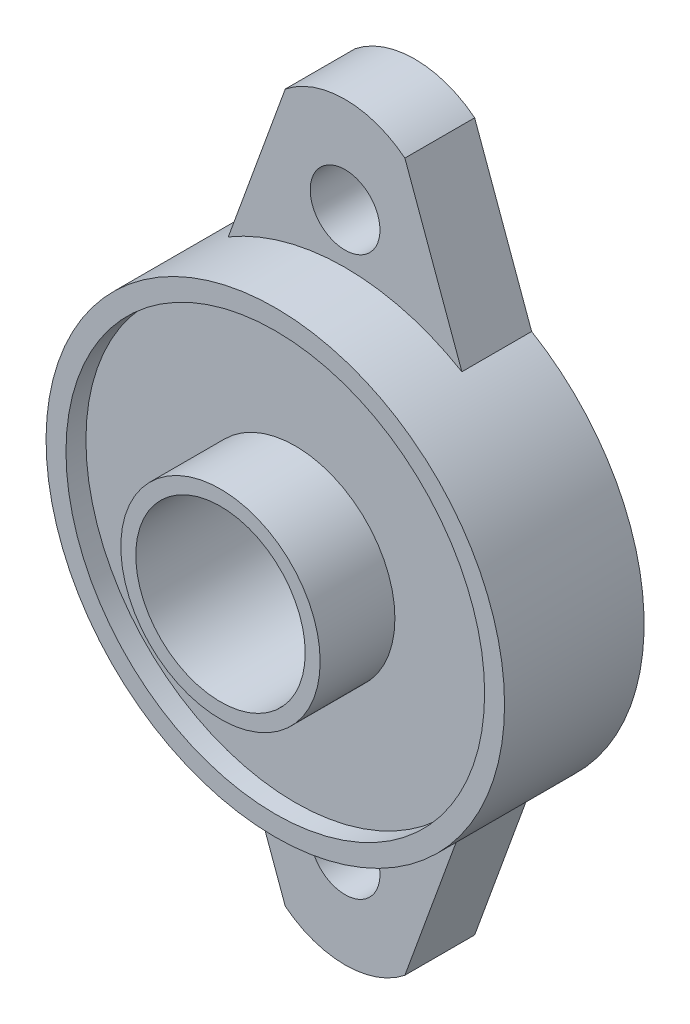
ISO-10303-21;
HEADER;
FILE_DESCRIPTION(('STEP AP214'),'2;1');
FILE_NAME('part.step','',(''),(''),'','','');
FILE_SCHEMA(('AUTOMOTIVE_DESIGN { 1 0 10303 214 1 1 1 1 }'));
ENDSEC;
DATA;
#1=APPLICATION_CONTEXT('core data for automotive mechanical design processes');
#2=APPLICATION_PROTOCOL_DEFINITION('international standard','automotive_design',2000,#1);
#3=PRODUCT_CONTEXT('',#1,'mechanical');
#4=PRODUCT('Part','Part','',(#3));
#5=PRODUCT_RELATED_PRODUCT_CATEGORY('part','',(#4));
#6=PRODUCT_DEFINITION_FORMATION('','',#4);
#7=PRODUCT_DEFINITION_CONTEXT('part definition',#1,'design');
#8=PRODUCT_DEFINITION('design','',#6,#7);
#9=PRODUCT_DEFINITION_SHAPE('','',#8);
#10=(LENGTH_UNIT() NAMED_UNIT(*) SI_UNIT(.MILLI.,.METRE.));
#11=(NAMED_UNIT(*) PLANE_ANGLE_UNIT() SI_UNIT($,.RADIAN.));
#12=(NAMED_UNIT(*) SI_UNIT($,.STERADIAN.) SOLID_ANGLE_UNIT());
#13=UNCERTAINTY_MEASURE_WITH_UNIT(LENGTH_MEASURE(1.E-05),#10,'distance_accuracy_value','');
#14=(GEOMETRIC_REPRESENTATION_CONTEXT(3) GLOBAL_UNCERTAINTY_ASSIGNED_CONTEXT((#13)) GLOBAL_UNIT_ASSIGNED_CONTEXT((#10,
#11,#12)) REPRESENTATION_CONTEXT('',''));
#15=CARTESIAN_POINT('',(0.,0.,0.));
#16=DIRECTION('',(0.,0.,1.));
#17=DIRECTION('',(1.,0.,0.));
#18=AXIS2_PLACEMENT_3D('',#15,#16,#17);
#19=CARTESIAN_POINT('',(0.,0.,14.));
#20=DIRECTION('',(0.,0.,1.));
#21=DIRECTION('',(1.,0.,0.));
#22=AXIS2_PLACEMENT_3D('',#19,#20,#21);
#23=PLANE('',#22);
#24=CARTESIAN_POINT('',(0.,0.,14.));
#25=DIRECTION('',(0.,0.,1.));
#26=DIRECTION('',(1.,0.,0.));
#27=AXIS2_PLACEMENT_3D('',#24,#25,#26);
#28=CIRCLE('',#27,21.);
#29=CARTESIAN_POINT('',(21.,0.,14.));
#30=VERTEX_POINT('',#29);
#31=EDGE_CURVE('E208',#30,#30,#28,.T.);
#32=ORIENTED_EDGE('',*,*,#31,.F.);
#33=EDGE_LOOP('',(#32));
#34=FACE_BOUND('',#33,.T.);
#35=CARTESIAN_POINT('',(0.,0.,14.));
#36=DIRECTION('',(0.,0.,1.));
#37=DIRECTION('',(1.,0.,0.));
#38=AXIS2_PLACEMENT_3D('',#35,#36,#37);
#39=CIRCLE('',#38,23.);
#40=CARTESIAN_POINT('',(23.,0.,14.));
#41=VERTEX_POINT('',#40);
#42=EDGE_CURVE('E196',#41,#41,#39,.T.);
#43=ORIENTED_EDGE('',*,*,#42,.T.);
#44=EDGE_LOOP('',(#43));
#45=FACE_BOUND('',#44,.T.);
#46=ADVANCED_FACE('F35',(#34,#45),#23,.T.);
#47=CARTESIAN_POINT('',(0.,0.,7.));
#48=DIRECTION('',(0.,0.,-1.));
#49=DIRECTION('',(-1.,0.,0.));
#50=AXIS2_PLACEMENT_3D('',#47,#48,#49);
#51=PLANE('',#50);
#52=CARTESIAN_POINT('',(0.,28.,7.));
#53=DIRECTION('',(0.,0.,1.));
#54=DIRECTION('',(1.,0.,0.));
#55=AXIS2_PLACEMENT_3D('',#52,#53,#54);
#56=CIRCLE('',#55,3.5);
#57=CARTESIAN_POINT('',(3.5,28.,7.));
#58=VERTEX_POINT('',#57);
#59=EDGE_CURVE('E137',#58,#58,#56,.T.);
#60=ORIENTED_EDGE('',*,*,#59,.F.);
#61=EDGE_LOOP('',(#60));
#62=FACE_BOUND('',#61,.T.);
#63=CARTESIAN_POINT('',(0.,0.,7.));
#64=DIRECTION('',(0.,0.,1.));
#65=DIRECTION('',(1.,0.,0.));
#66=AXIS2_PLACEMENT_3D('',#63,#64,#65);
#67=CIRCLE('',#66,23.);
#68=CARTESIAN_POINT('',(11.7174446423163,19.7914499482543,7.));
#69=VERTEX_POINT('',#68);
#70=CARTESIAN_POINT('',(-11.7174446423163,19.7914499482543,7.));
#71=VERTEX_POINT('',#70);
#72=EDGE_CURVE('E46',#69,#71,#67,.T.);
#73=ORIENTED_EDGE('',*,*,#72,.F.);
#74=DIRECTION('',(-0.342020143325669,0.939692620785908,0.));
#75=VECTOR('',#74,1.);
#76=CARTESIAN_POINT('',(11.7174446423163,19.7914499482543,7.));
#77=LINE('',#76,#75);
#78=CARTESIAN_POINT('',(6.,35.5,7.));
#79=VERTEX_POINT('',#78);
#80=EDGE_CURVE('E99',#69,#79,#77,.T.);
#81=ORIENTED_EDGE('',*,*,#80,.T.);
#82=CARTESIAN_POINT('',(0.,28.,7.));
#83=DIRECTION('',(0.,0.,1.));
#84=DIRECTION('',(1.,0.,0.));
#85=AXIS2_PLACEMENT_3D('',#82,#83,#84);
#86=CIRCLE('',#85,9.60468635614927);
#87=CARTESIAN_POINT('',(-6.,35.5,7.));
#88=VERTEX_POINT('',#87);
#89=EDGE_CURVE('E180',#79,#88,#86,.T.);
#90=ORIENTED_EDGE('',*,*,#89,.T.);
#91=DIRECTION('',(-0.342020143325669,-0.939692620785908,0.));
#92=VECTOR('',#91,1.);
#93=CARTESIAN_POINT('',(-11.7174446423163,19.7914499482543,7.));
#94=LINE('',#93,#92);
#95=EDGE_CURVE('E118',#88,#71,#94,.T.);
#96=ORIENTED_EDGE('',*,*,#95,.T.);
#97=EDGE_LOOP('',(#73,#81,#90,#96));
#98=FACE_BOUND('',#97,.T.);
#99=ADVANCED_FACE('F233',(#62,#98),#51,.F.);
#100=CARTESIAN_POINT('',(0.,-28.,7.));
#101=DIRECTION('',(0.,0.,1.));
#102=DIRECTION('',(-1.,0.,0.));
#103=AXIS2_PLACEMENT_3D('',#100,#101,#102);
#104=CIRCLE('',#103,3.5);
#105=CARTESIAN_POINT('',(-3.5,-28.,7.));
#106=VERTEX_POINT('',#105);
#107=EDGE_CURVE('E192',#106,#106,#104,.T.);
#108=ORIENTED_EDGE('',*,*,#107,.F.);
#109=EDGE_LOOP('',(#108));
#110=FACE_BOUND('',#109,.T.);
#111=CARTESIAN_POINT('',(-11.7174446423163,-19.7914499482543,7.));
#112=VERTEX_POINT('',#111);
#113=CARTESIAN_POINT('',(11.7174446423163,-19.7914499482543,7.));
#114=VERTEX_POINT('',#113);
#115=EDGE_CURVE('E11',#112,#114,#67,.T.);
#116=ORIENTED_EDGE('',*,*,#115,.F.);
#117=DIRECTION('',(0.342020143325669,-0.939692620785908,0.));
#118=VECTOR('',#117,1.);
#119=CARTESIAN_POINT('',(-11.7174446423163,-19.7914499482543,7.));
#120=LINE('',#119,#118);
#121=CARTESIAN_POINT('',(-6.,-35.5,7.));
#122=VERTEX_POINT('',#121);
#123=EDGE_CURVE('E110',#112,#122,#120,.T.);
#124=ORIENTED_EDGE('',*,*,#123,.T.);
#125=CARTESIAN_POINT('',(0.,-28.,7.));
#126=DIRECTION('',(0.,0.,1.));
#127=DIRECTION('',(-1.,0.,0.));
#128=AXIS2_PLACEMENT_3D('',#125,#126,#127);
#129=CIRCLE('',#128,9.60468635614927);
#130=CARTESIAN_POINT('',(6.,-35.5,7.));
#131=VERTEX_POINT('',#130);
#132=EDGE_CURVE('E114',#122,#131,#129,.T.);
#133=ORIENTED_EDGE('',*,*,#132,.T.);
#134=DIRECTION('',(0.342020143325669,0.939692620785908,0.));
#135=VECTOR('',#134,1.);
#136=CARTESIAN_POINT('',(11.7174446423163,-19.7914499482543,7.));
#137=LINE('',#136,#135);
#138=EDGE_CURVE('E54',#131,#114,#137,.T.);
#139=ORIENTED_EDGE('',*,*,#138,.T.);
#140=EDGE_LOOP('',(#116,#124,#133,#139));
#141=FACE_BOUND('',#140,.T.);
#142=ADVANCED_FACE('F112',(#110,#141),#51,.F.);
#143=CARTESIAN_POINT('',(0.,0.,0.));
#144=DIRECTION('',(0.,0.,-1.));
#145=DIRECTION('',(-1.,0.,0.));
#146=AXIS2_PLACEMENT_3D('',#143,#144,#145);
#147=PLANE('',#146);
#148=CARTESIAN_POINT('',(0.,0.,0.));
#149=DIRECTION('',(0.,0.,1.));
#150=DIRECTION('',(1.,0.,0.));
#151=AXIS2_PLACEMENT_3D('',#148,#149,#150);
#152=CIRCLE('',#151,8.5);
#153=CARTESIAN_POINT('',(8.5,0.,0.));
#154=VERTEX_POINT('',#153);
#155=EDGE_CURVE('E187',#154,#154,#152,.T.);
#156=ORIENTED_EDGE('',*,*,#155,.T.);
#157=EDGE_LOOP('',(#156));
#158=FACE_BOUND('',#157,.T.);
#159=CARTESIAN_POINT('',(0.,0.,0.));
#160=DIRECTION('',(0.,0.,1.));
#161=DIRECTION('',(-1.,0.,0.));
#162=AXIS2_PLACEMENT_3D('',#159,#160,#161);
#163=CIRCLE('',#162,23.);
#164=CARTESIAN_POINT('',(11.7174446423163,-19.7914499482543,0.));
#165=VERTEX_POINT('',#164);
#166=CARTESIAN_POINT('',(11.7174446423163,19.7914499482543,0.));
#167=VERTEX_POINT('',#166);
#168=EDGE_CURVE('E133',#165,#167,#163,.T.);
#169=ORIENTED_EDGE('',*,*,#168,.F.);
#170=DIRECTION('',(0.342020143325669,0.939692620785908,0.));
#171=VECTOR('',#170,1.);
#172=CARTESIAN_POINT('',(11.7174446423163,-19.7914499482543,0.));
#173=LINE('',#172,#171);
#174=CARTESIAN_POINT('',(6.,-35.5,0.));
#175=VERTEX_POINT('',#174);
#176=EDGE_CURVE('E90',#175,#165,#173,.T.);
#177=ORIENTED_EDGE('',*,*,#176,.F.);
#178=CARTESIAN_POINT('',(0.,-28.,0.));
#179=DIRECTION('',(0.,0.,1.));
#180=DIRECTION('',(-1.,0.,0.));
#181=AXIS2_PLACEMENT_3D('',#178,#179,#180);
#182=CIRCLE('',#181,9.60468635614927);
#183=CARTESIAN_POINT('',(-6.,-35.5,0.));
#184=VERTEX_POINT('',#183);
#185=EDGE_CURVE('E84',#184,#175,#182,.T.);
#186=ORIENTED_EDGE('',*,*,#185,.F.);
#187=DIRECTION('',(0.342020143325669,-0.939692620785908,0.));
#188=VECTOR('',#187,1.);
#189=CARTESIAN_POINT('',(-11.7174446423163,-19.7914499482543,0.));
#190=LINE('',#189,#188);
#191=CARTESIAN_POINT('',(-11.7174446423163,-19.7914499482543,0.));
#192=VERTEX_POINT('',#191);
#193=EDGE_CURVE('E123',#192,#184,#190,.T.);
#194=ORIENTED_EDGE('',*,*,#193,.F.);
#195=CARTESIAN_POINT('',(0.,0.,0.));
#196=DIRECTION('',(0.,0.,1.));
#197=DIRECTION('',(1.,0.,0.));
#198=AXIS2_PLACEMENT_3D('',#195,#196,#197);
#199=CIRCLE('',#198,23.);
#200=CARTESIAN_POINT('',(-11.7174446423163,19.7914499482543,0.));
#201=VERTEX_POINT('',#200);
#202=EDGE_CURVE('E143',#201,#192,#199,.T.);
#203=ORIENTED_EDGE('',*,*,#202,.F.);
#204=DIRECTION('',(-0.342020143325669,-0.939692620785908,0.));
#205=VECTOR('',#204,1.);
#206=CARTESIAN_POINT('',(-11.7174446423163,19.7914499482543,0.));
#207=LINE('',#206,#205);
#208=CARTESIAN_POINT('',(-6.,35.5,0.));
#209=VERTEX_POINT('',#208);
#210=EDGE_CURVE('E141',#209,#201,#207,.T.);
#211=ORIENTED_EDGE('',*,*,#210,.F.);
#212=CARTESIAN_POINT('',(0.,28.,0.));
#213=DIRECTION('',(0.,0.,1.));
#214=DIRECTION('',(1.,0.,0.));
#215=AXIS2_PLACEMENT_3D('',#212,#213,#214);
#216=CIRCLE('',#215,9.60468635614927);
#217=CARTESIAN_POINT('',(6.,35.5,0.));
#218=VERTEX_POINT('',#217);
#219=EDGE_CURVE('E139',#218,#209,#216,.T.);
#220=ORIENTED_EDGE('',*,*,#219,.F.);
#221=DIRECTION('',(-0.342020143325669,0.939692620785908,0.));
#222=VECTOR('',#221,1.);
#223=CARTESIAN_POINT('',(11.7174446423163,19.7914499482543,0.));
#224=LINE('',#223,#222);
#225=EDGE_CURVE('E136',#167,#218,#224,.T.);
#226=ORIENTED_EDGE('',*,*,#225,.F.);
#227=EDGE_LOOP('',(#169,#177,#186,#194,#203,#211,#220,#226));
#228=FACE_BOUND('',#227,.T.);
#229=CARTESIAN_POINT('',(0.,28.,0.));
#230=DIRECTION('',(0.,0.,1.));
#231=DIRECTION('',(1.,0.,0.));
#232=AXIS2_PLACEMENT_3D('',#229,#230,#231);
#233=CIRCLE('',#232,3.5);
#234=CARTESIAN_POINT('',(3.5,28.,0.));
#235=VERTEX_POINT('',#234);
#236=EDGE_CURVE('E184',#235,#235,#233,.T.);
#237=ORIENTED_EDGE('',*,*,#236,.T.);
#238=EDGE_LOOP('',(#237));
#239=FACE_BOUND('',#238,.T.);
#240=CARTESIAN_POINT('',(0.,-28.,0.));
#241=DIRECTION('',(0.,0.,1.));
#242=DIRECTION('',(-1.,0.,0.));
#243=AXIS2_PLACEMENT_3D('',#240,#241,#242);
#244=CIRCLE('',#243,3.5);
#245=CARTESIAN_POINT('',(-3.5,-28.,0.));
#246=VERTEX_POINT('',#245);
#247=EDGE_CURVE('E193',#246,#246,#244,.T.);
#248=ORIENTED_EDGE('',*,*,#247,.T.);
#249=EDGE_LOOP('',(#248));
#250=FACE_BOUND('',#249,.T.);
#251=ADVANCED_FACE('F170',(#158,#228,#239,#250),#147,.T.);
#252=CARTESIAN_POINT('',(11.7174446423163,19.7914499482543,7.));
#253=DIRECTION('',(-0.939692620785908,-0.342020143325669,0.));
#254=DIRECTION('',(0.342020143325669,-0.939692620785908,0.));
#255=AXIS2_PLACEMENT_3D('',#252,#253,#254);
#256=PLANE('',#255);
#257=ORIENTED_EDGE('',*,*,#225,.T.);
#258=DIRECTION('',(0.,0.,-1.));
#259=VECTOR('',#258,1.);
#260=CARTESIAN_POINT('',(6.,35.5,7.));
#261=LINE('',#260,#259);
#262=EDGE_CURVE('E156',#79,#218,#261,.T.);
#263=ORIENTED_EDGE('',*,*,#262,.F.);
#264=ORIENTED_EDGE('',*,*,#80,.F.);
#265=DIRECTION('',(0.,0.,-1.));
#266=VECTOR('',#265,1.);
#267=CARTESIAN_POINT('',(11.7174446423163,19.7914499482543,7.));
#268=LINE('',#267,#266);
#269=EDGE_CURVE('E39',#69,#167,#268,.T.);
#270=ORIENTED_EDGE('',*,*,#269,.T.);
#271=EDGE_LOOP('',(#257,#263,#264,#270));
#272=FACE_BOUND('',#271,.T.);
#273=ADVANCED_FACE('F37',(#272),#256,.F.);
#274=CARTESIAN_POINT('',(0.,28.,7.));
#275=DIRECTION('',(0.,0.,-1.));
#276=DIRECTION('',(-1.,0.,0.));
#277=AXIS2_PLACEMENT_3D('',#274,#275,#276);
#278=CYLINDRICAL_SURFACE('',#277,9.60468635614927);
#279=ORIENTED_EDGE('',*,*,#219,.T.);
#280=DIRECTION('',(0.,0.,-1.));
#281=VECTOR('',#280,1.);
#282=CARTESIAN_POINT('',(-6.,35.5,7.));
#283=LINE('',#282,#281);
#284=EDGE_CURVE('E154',#88,#209,#283,.T.);
#285=ORIENTED_EDGE('',*,*,#284,.F.);
#286=ORIENTED_EDGE('',*,*,#89,.F.);
#287=ORIENTED_EDGE('',*,*,#262,.T.);
#288=EDGE_LOOP('',(#279,#285,#286,#287));
#289=FACE_BOUND('',#288,.T.);
#290=ADVANCED_FACE('F175',(#289),#278,.T.);
#291=CARTESIAN_POINT('',(-11.7174446423163,19.7914499482543,7.));
#292=DIRECTION('',(0.939692620785908,-0.342020143325669,0.));
#293=DIRECTION('',(0.342020143325669,0.939692620785908,0.));
#294=AXIS2_PLACEMENT_3D('',#291,#292,#293);
#295=PLANE('',#294);
#296=ORIENTED_EDGE('',*,*,#210,.T.);
#297=DIRECTION('',(0.,0.,-1.));
#298=VECTOR('',#297,1.);
#299=CARTESIAN_POINT('',(-11.7174446423163,19.7914499482543,7.));
#300=LINE('',#299,#298);
#301=EDGE_CURVE('E151',#71,#201,#300,.T.);
#302=ORIENTED_EDGE('',*,*,#301,.F.);
#303=ORIENTED_EDGE('',*,*,#95,.F.);
#304=ORIENTED_EDGE('',*,*,#284,.T.);
#305=EDGE_LOOP('',(#296,#302,#303,#304));
#306=FACE_BOUND('',#305,.T.);
#307=ADVANCED_FACE('F178',(#306),#295,.F.);
#308=CARTESIAN_POINT('',(0.,0.,7.));
#309=DIRECTION('',(0.,0.,-1.));
#310=DIRECTION('',(-1.,0.,0.));
#311=AXIS2_PLACEMENT_3D('',#308,#309,#310);
#312=CYLINDRICAL_SURFACE('',#311,23.);
#313=ORIENTED_EDGE('',*,*,#202,.T.);
#314=DIRECTION('',(0.,0.,-1.));
#315=VECTOR('',#314,1.);
#316=CARTESIAN_POINT('',(-11.7174446423163,-19.7914499482543,7.));
#317=LINE('',#316,#315);
#318=EDGE_CURVE('E124',#112,#192,#317,.T.);
#319=ORIENTED_EDGE('',*,*,#318,.F.);
#320=ORIENTED_EDGE('',*,*,#115,.T.);
#321=DIRECTION('',(0.,0.,-1.));
#322=VECTOR('',#321,1.);
#323=CARTESIAN_POINT('',(11.7174446423163,-19.7914499482543,7.));
#324=LINE('',#323,#322);
#325=EDGE_CURVE('E129',#114,#165,#324,.T.);
#326=ORIENTED_EDGE('',*,*,#325,.T.);
#327=ORIENTED_EDGE('',*,*,#168,.T.);
#328=ORIENTED_EDGE('',*,*,#269,.F.);
#329=ORIENTED_EDGE('',*,*,#72,.T.);
#330=ORIENTED_EDGE('',*,*,#301,.T.);
#331=EDGE_LOOP('',(#313,#319,#320,#326,#327,#328,#329,#330));
#332=FACE_BOUND('',#331,.T.);
#333=ORIENTED_EDGE('',*,*,#42,.F.);
#334=EDGE_LOOP('',(#333));
#335=FACE_BOUND('',#334,.T.);
#336=ADVANCED_FACE('F167',(#332,#335),#312,.T.);
#337=CARTESIAN_POINT('',(-11.7174446423163,-19.7914499482543,7.));
#338=DIRECTION('',(0.939692620785908,0.342020143325669,0.));
#339=DIRECTION('',(-0.342020143325669,0.939692620785908,0.));
#340=AXIS2_PLACEMENT_3D('',#337,#338,#339);
#341=PLANE('',#340);
#342=ORIENTED_EDGE('',*,*,#193,.T.);
#343=DIRECTION('',(0.,0.,-1.));
#344=VECTOR('',#343,1.);
#345=CARTESIAN_POINT('',(-6.,-35.5,7.));
#346=LINE('',#345,#344);
#347=EDGE_CURVE('E120',#122,#184,#346,.T.);
#348=ORIENTED_EDGE('',*,*,#347,.F.);
#349=ORIENTED_EDGE('',*,*,#123,.F.);
#350=ORIENTED_EDGE('',*,*,#318,.T.);
#351=EDGE_LOOP('',(#342,#348,#349,#350));
#352=FACE_BOUND('',#351,.T.);
#353=ADVANCED_FACE('F121',(#352),#341,.F.);
#354=CARTESIAN_POINT('',(0.,-28.,7.));
#355=DIRECTION('',(0.,0.,-1.));
#356=DIRECTION('',(-1.,0.,0.));
#357=AXIS2_PLACEMENT_3D('',#354,#355,#356);
#358=CYLINDRICAL_SURFACE('',#357,9.60468635614927);
#359=ORIENTED_EDGE('',*,*,#185,.T.);
#360=DIRECTION('',(0.,0.,-1.));
#361=VECTOR('',#360,1.);
#362=CARTESIAN_POINT('',(6.,-35.5,7.));
#363=LINE('',#362,#361);
#364=EDGE_CURVE('E125',#131,#175,#363,.T.);
#365=ORIENTED_EDGE('',*,*,#364,.F.);
#366=ORIENTED_EDGE('',*,*,#132,.F.);
#367=ORIENTED_EDGE('',*,*,#347,.T.);
#368=EDGE_LOOP('',(#359,#365,#366,#367));
#369=FACE_BOUND('',#368,.T.);
#370=ADVANCED_FACE('F127',(#369),#358,.T.);
#371=CARTESIAN_POINT('',(11.7174446423163,-19.7914499482543,7.));
#372=DIRECTION('',(-0.939692620785908,0.342020143325669,0.));
#373=DIRECTION('',(-0.342020143325669,-0.939692620785908,0.));
#374=AXIS2_PLACEMENT_3D('',#371,#372,#373);
#375=PLANE('',#374);
#376=ORIENTED_EDGE('',*,*,#176,.T.);
#377=ORIENTED_EDGE('',*,*,#325,.F.);
#378=ORIENTED_EDGE('',*,*,#138,.F.);
#379=ORIENTED_EDGE('',*,*,#364,.T.);
#380=EDGE_LOOP('',(#376,#377,#378,#379));
#381=FACE_BOUND('',#380,.T.);
#382=ADVANCED_FACE('F261',(#381),#375,.F.);
#383=CARTESIAN_POINT('',(0.,28.,7.));
#384=DIRECTION('',(0.,0.,-1.));
#385=DIRECTION('',(-1.,0.,0.));
#386=AXIS2_PLACEMENT_3D('',#383,#384,#385);
#387=CYLINDRICAL_SURFACE('',#386,3.5);
#388=ORIENTED_EDGE('',*,*,#59,.T.);
#389=EDGE_LOOP('',(#388));
#390=FACE_BOUND('',#389,.T.);
#391=ORIENTED_EDGE('',*,*,#236,.F.);
#392=EDGE_LOOP('',(#391));
#393=FACE_BOUND('',#392,.T.);
#394=ADVANCED_FACE('F263',(#390,#393),#387,.F.);
#395=CARTESIAN_POINT('',(0.,0.,7.));
#396=DIRECTION('',(0.,0.,-1.));
#397=DIRECTION('',(-1.,0.,0.));
#398=AXIS2_PLACEMENT_3D('',#395,#396,#397);
#399=CYLINDRICAL_SURFACE('',#398,8.5);
#400=ORIENTED_EDGE('',*,*,#155,.F.);
#401=EDGE_LOOP('',(#400));
#402=FACE_BOUND('',#401,.T.);
#403=CARTESIAN_POINT('',(0.,0.,19.5));
#404=DIRECTION('',(0.,0.,1.));
#405=DIRECTION('',(1.,0.,0.));
#406=AXIS2_PLACEMENT_3D('',#403,#404,#405);
#407=CIRCLE('',#406,8.5);
#408=CARTESIAN_POINT('',(8.5,0.,19.5));
#409=VERTEX_POINT('',#408);
#410=EDGE_CURVE('E204',#409,#409,#407,.T.);
#411=ORIENTED_EDGE('',*,*,#410,.T.);
#412=EDGE_LOOP('',(#411));
#413=FACE_BOUND('',#412,.T.);
#414=ADVANCED_FACE('F280',(#402,#413),#399,.F.);
#415=CARTESIAN_POINT('',(0.,-28.,7.));
#416=DIRECTION('',(0.,0.,-1.));
#417=DIRECTION('',(-1.,0.,0.));
#418=AXIS2_PLACEMENT_3D('',#415,#416,#417);
#419=CYLINDRICAL_SURFACE('',#418,3.5);
#420=ORIENTED_EDGE('',*,*,#107,.T.);
#421=EDGE_LOOP('',(#420));
#422=FACE_BOUND('',#421,.T.);
#423=ORIENTED_EDGE('',*,*,#247,.F.);
#424=EDGE_LOOP('',(#423));
#425=FACE_BOUND('',#424,.T.);
#426=ADVANCED_FACE('F287',(#422,#425),#419,.F.);
#427=CARTESIAN_POINT('',(0.,0.,19.5));
#428=DIRECTION('',(0.,0.,1.));
#429=DIRECTION('',(1.,0.,0.));
#430=AXIS2_PLACEMENT_3D('',#427,#428,#429);
#431=PLANE('',#430);
#432=CARTESIAN_POINT('',(0.,0.,19.5));
#433=DIRECTION('',(0.,0.,1.));
#434=DIRECTION('',(1.,0.,0.));
#435=AXIS2_PLACEMENT_3D('',#432,#433,#434);
#436=CIRCLE('',#435,10.);
#437=CARTESIAN_POINT('',(10.,0.,19.5));
#438=VERTEX_POINT('',#437);
#439=EDGE_CURVE('E199',#438,#438,#436,.T.);
#440=ORIENTED_EDGE('',*,*,#439,.T.);
#441=EDGE_LOOP('',(#440));
#442=FACE_BOUND('',#441,.T.);
#443=ORIENTED_EDGE('',*,*,#410,.F.);
#444=EDGE_LOOP('',(#443));
#445=FACE_BOUND('',#444,.T.);
#446=ADVANCED_FACE('F295',(#442,#445),#431,.T.);
#447=CARTESIAN_POINT('',(0.,0.,19.5));
#448=DIRECTION('',(0.,0.,-1.));
#449=DIRECTION('',(-1.,0.,0.));
#450=AXIS2_PLACEMENT_3D('',#447,#448,#449);
#451=CYLINDRICAL_SURFACE('',#450,10.);
#452=ORIENTED_EDGE('',*,*,#439,.F.);
#453=EDGE_LOOP('',(#452));
#454=FACE_BOUND('',#453,.T.);
#455=CARTESIAN_POINT('',(0.,0.,12.));
#456=DIRECTION('',(0.,0.,1.));
#457=DIRECTION('',(1.,0.,0.));
#458=AXIS2_PLACEMENT_3D('',#455,#456,#457);
#459=CIRCLE('',#458,10.);
#460=CARTESIAN_POINT('',(10.,0.,12.));
#461=VERTEX_POINT('',#460);
#462=EDGE_CURVE('E211',#461,#461,#459,.T.);
#463=ORIENTED_EDGE('',*,*,#462,.T.);
#464=EDGE_LOOP('',(#463));
#465=FACE_BOUND('',#464,.T.);
#466=ADVANCED_FACE('F217',(#454,#465),#451,.T.);
#467=CARTESIAN_POINT('',(0.,0.,12.));
#468=DIRECTION('',(0.,0.,1.));
#469=DIRECTION('',(1.,0.,0.));
#470=AXIS2_PLACEMENT_3D('',#467,#468,#469);
#471=CYLINDRICAL_SURFACE('',#470,21.);
#472=CARTESIAN_POINT('',(0.,0.,12.));
#473=DIRECTION('',(0.,0.,1.));
#474=DIRECTION('',(1.,0.,0.));
#475=AXIS2_PLACEMENT_3D('',#472,#473,#474);
#476=CIRCLE('',#475,21.);
#477=CARTESIAN_POINT('',(21.,0.,12.));
#478=VERTEX_POINT('',#477);
#479=EDGE_CURVE('E207',#478,#478,#476,.T.);
#480=ORIENTED_EDGE('',*,*,#479,.F.);
#481=EDGE_LOOP('',(#480));
#482=FACE_BOUND('',#481,.T.);
#483=ORIENTED_EDGE('',*,*,#31,.T.);
#484=EDGE_LOOP('',(#483));
#485=FACE_BOUND('',#484,.T.);
#486=ADVANCED_FACE('F222',(#482,#485),#471,.F.);
#487=CARTESIAN_POINT('',(0.,0.,12.));
#488=DIRECTION('',(0.,0.,1.));
#489=DIRECTION('',(1.,0.,0.));
#490=AXIS2_PLACEMENT_3D('',#487,#488,#489);
#491=PLANE('',#490);
#492=ORIENTED_EDGE('',*,*,#462,.F.);
#493=EDGE_LOOP('',(#492));
#494=FACE_BOUND('',#493,.T.);
#495=ORIENTED_EDGE('',*,*,#479,.T.);
#496=EDGE_LOOP('',(#495));
#497=FACE_BOUND('',#496,.T.);
#498=ADVANCED_FACE('F219',(#494,#497),#491,.T.);
#499=CLOSED_SHELL('',(#46,#99,#142,#251,#273,#290,#307,#336,#353,#370,#382,#394,#414,#426,#446,
#466,#486,#498));
#500=MANIFOLD_SOLID_BREP('B2',#499);
#501=ADVANCED_BREP_SHAPE_REPRESENTATION('',(#18,#500),#14);
#502=SHAPE_DEFINITION_REPRESENTATION(#9,#501);
ENDSEC;
END-ISO-10303-21;
